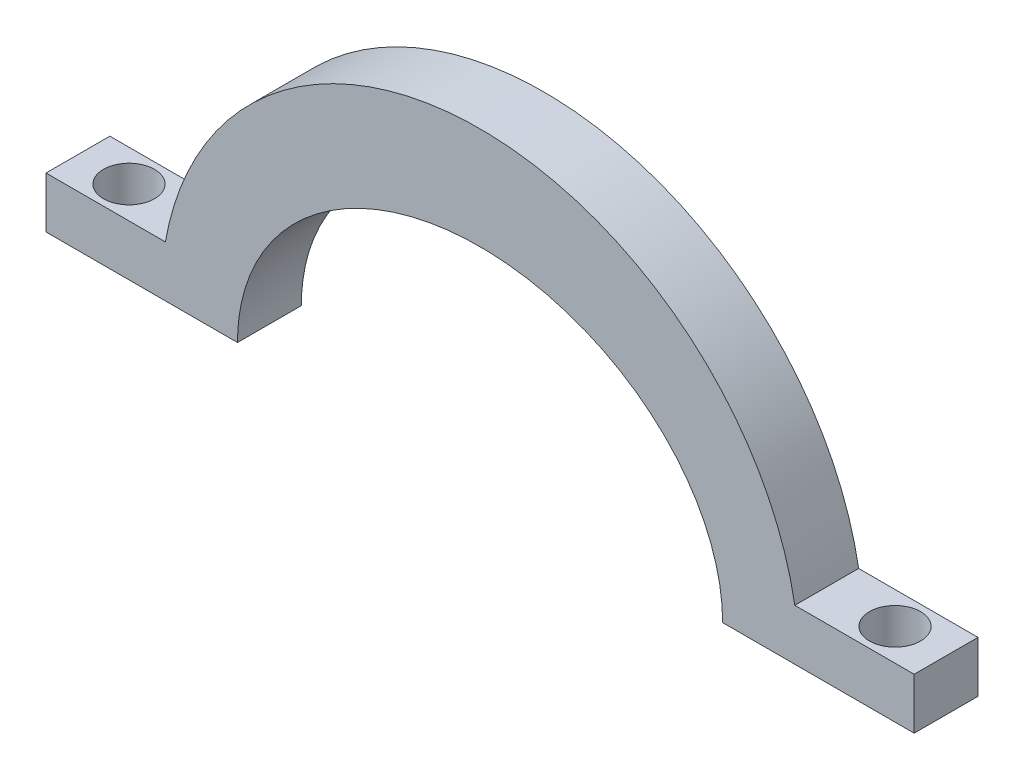
ISO-10303-21;
HEADER;
FILE_DESCRIPTION(('STEP AP214'),'2;1');
FILE_NAME('part.step','',(''),(''),'','','');
FILE_SCHEMA(('AUTOMOTIVE_DESIGN { 1 0 10303 214 1 1 1 1 }'));
ENDSEC;
DATA;
#1=APPLICATION_CONTEXT('core data for automotive mechanical design processes');
#2=APPLICATION_PROTOCOL_DEFINITION('international standard','automotive_design',2000,#1);
#3=PRODUCT_CONTEXT('',#1,'mechanical');
#4=PRODUCT('Part','Part','',(#3));
#5=PRODUCT_RELATED_PRODUCT_CATEGORY('part','',(#4));
#6=PRODUCT_DEFINITION_FORMATION('','',#4);
#7=PRODUCT_DEFINITION_CONTEXT('part definition',#1,'design');
#8=PRODUCT_DEFINITION('design','',#6,#7);
#9=PRODUCT_DEFINITION_SHAPE('','',#8);
#10=(LENGTH_UNIT() NAMED_UNIT(*) SI_UNIT(.MILLI.,.METRE.));
#11=(NAMED_UNIT(*) PLANE_ANGLE_UNIT() SI_UNIT($,.RADIAN.));
#12=(NAMED_UNIT(*) SI_UNIT($,.STERADIAN.) SOLID_ANGLE_UNIT());
#13=UNCERTAINTY_MEASURE_WITH_UNIT(LENGTH_MEASURE(1.E-05),#10,'distance_accuracy_value','');
#14=(GEOMETRIC_REPRESENTATION_CONTEXT(3) GLOBAL_UNCERTAINTY_ASSIGNED_CONTEXT((#13)) GLOBAL_UNIT_ASSIGNED_CONTEXT((#10,
#11,#12)) REPRESENTATION_CONTEXT('',''));
#15=CARTESIAN_POINT('',(0.,0.,0.));
#16=DIRECTION('',(0.,0.,1.));
#17=DIRECTION('',(1.,0.,0.));
#18=AXIS2_PLACEMENT_3D('',#15,#16,#17);
#19=CARTESIAN_POINT('',(0.,0.,5.));
#20=DIRECTION('',(0.,1.,0.));
#21=DIRECTION('',(0.,0.,1.));
#22=AXIS2_PLACEMENT_3D('',#19,#20,#21);
#23=PLANE('',#22);
#24=CARTESIAN_POINT('',(30.,0.,2.5));
#25=DIRECTION('',(0.,-1.,0.));
#26=DIRECTION('',(0.,0.,1.));
#27=AXIS2_PLACEMENT_3D('',#24,#25,#26);
#28=CIRCLE('',#27,2.00000000000001);
#29=CARTESIAN_POINT('',(30.,0.,4.5));
#30=VERTEX_POINT('',#29);
#31=EDGE_CURVE('E214',#30,#30,#28,.T.);
#32=ORIENTED_EDGE('',*,*,#31,.F.);
#33=EDGE_LOOP('',(#32));
#34=FACE_BOUND('',#33,.T.);
#35=DIRECTION('',(1.,0.,0.));
#36=VECTOR('',#35,1.);
#37=CARTESIAN_POINT('',(0.,0.,0.));
#38=LINE('',#37,#36);
#39=CARTESIAN_POINT('',(19.,0.,0.));
#40=VERTEX_POINT('',#39);
#41=CARTESIAN_POINT('',(34.,0.,0.));
#42=VERTEX_POINT('',#41);
#43=EDGE_CURVE('E176',#40,#42,#38,.T.);
#44=ORIENTED_EDGE('',*,*,#43,.T.);
#45=DIRECTION('',(0.,0.,1.));
#46=VECTOR('',#45,1.);
#47=CARTESIAN_POINT('',(34.,0.,5.));
#48=LINE('',#47,#46);
#49=CARTESIAN_POINT('',(34.,0.,5.));
#50=VERTEX_POINT('',#49);
#51=EDGE_CURVE('E147',#42,#50,#48,.T.);
#52=ORIENTED_EDGE('',*,*,#51,.T.);
#53=DIRECTION('',(1.,0.,0.));
#54=VECTOR('',#53,1.);
#55=CARTESIAN_POINT('',(0.,0.,5.));
#56=LINE('',#55,#54);
#57=CARTESIAN_POINT('',(19.,0.,5.));
#58=VERTEX_POINT('',#57);
#59=EDGE_CURVE('E177',#58,#50,#56,.T.);
#60=ORIENTED_EDGE('',*,*,#59,.F.);
#61=DIRECTION('',(0.,0.,-1.));
#62=VECTOR('',#61,1.);
#63=CARTESIAN_POINT('',(19.,0.,5.));
#64=LINE('',#63,#62);
#65=EDGE_CURVE('E58',#58,#40,#64,.T.);
#66=ORIENTED_EDGE('',*,*,#65,.T.);
#67=EDGE_LOOP('',(#44,#52,#60,#66));
#68=FACE_BOUND('',#67,.T.);
#69=ADVANCED_FACE('F47',(#34,#68),#23,.F.);
#70=CARTESIAN_POINT('',(0.,0.,5.));
#71=DIRECTION('',(0.,0.,1.));
#72=DIRECTION('',(1.,0.,0.));
#73=AXIS2_PLACEMENT_3D('',#70,#71,#72);
#74=ELLIPSE('',#73,25.,24.);
#75=DIRECTION('',(0.,0.,-1.));
#76=VECTOR('',#75,1.);
#77=SURFACE_OF_LINEAR_EXTRUSION('',#74,#76);
#78=CARTESIAN_POINT('',(0.,0.,0.));
#79=DIRECTION('',(0.,0.,1.));
#80=DIRECTION('',(1.,0.,0.));
#81=AXIS2_PLACEMENT_3D('',#78,#79,#80);
#82=ELLIPSE('',#81,25.,24.);
#83=CARTESIAN_POINT('',(24.6503324295817,4.,0.));
#84=VERTEX_POINT('',#83);
#85=CARTESIAN_POINT('',(-24.6503324295817,4.,0.));
#86=VERTEX_POINT('',#85);
#87=EDGE_CURVE('E222',#84,#86,#82,.T.);
#88=ORIENTED_EDGE('',*,*,#87,.T.);
#89=DIRECTION('',(0.,0.,-1.));
#90=VECTOR('',#89,1.);
#91=CARTESIAN_POINT('',(-24.6503324295817,4.,5.));
#92=LINE('',#91,#90);
#93=CARTESIAN_POINT('',(-24.6503324295817,4.,5.));
#94=VERTEX_POINT('',#93);
#95=EDGE_CURVE('E173',#86,#94,#92,.F.);
#96=ORIENTED_EDGE('',*,*,#95,.T.);
#97=CARTESIAN_POINT('',(24.6503324295817,4.,5.));
#98=VERTEX_POINT('',#97);
#99=EDGE_CURVE('E66',#98,#94,#74,.T.);
#100=ORIENTED_EDGE('',*,*,#99,.F.);
#101=DIRECTION('',(0.,0.,-1.));
#102=VECTOR('',#101,1.);
#103=CARTESIAN_POINT('',(24.6503324295817,4.,5.));
#104=LINE('',#103,#102);
#105=EDGE_CURVE('E70',#98,#84,#104,.T.);
#106=ORIENTED_EDGE('',*,*,#105,.T.);
#107=EDGE_LOOP('',(#88,#96,#100,#106));
#108=FACE_BOUND('',#107,.T.);
#109=ADVANCED_FACE('F49',(#108),#77,.F.);
#110=CARTESIAN_POINT('',(-30.,0.,2.5));
#111=DIRECTION('',(0.,-1.,0.));
#112=DIRECTION('',(0.,0.,-1.));
#113=AXIS2_PLACEMENT_3D('',#110,#111,#112);
#114=CIRCLE('',#113,2.);
#115=CARTESIAN_POINT('',(-30.,0.,0.499999999999994));
#116=VERTEX_POINT('',#115);
#117=EDGE_CURVE('E299',#116,#116,#114,.T.);
#118=ORIENTED_EDGE('',*,*,#117,.F.);
#119=EDGE_LOOP('',(#118));
#120=FACE_BOUND('',#119,.T.);
#121=CARTESIAN_POINT('',(-34.,0.,0.));
#122=VERTEX_POINT('',#121);
#123=CARTESIAN_POINT('',(-19.,0.,0.));
#124=VERTEX_POINT('',#123);
#125=EDGE_CURVE('E223',#122,#124,#38,.T.);
#126=ORIENTED_EDGE('',*,*,#125,.T.);
#127=DIRECTION('',(0.,0.,-1.));
#128=VECTOR('',#127,1.);
#129=CARTESIAN_POINT('',(-19.,0.,5.));
#130=LINE('',#129,#128);
#131=CARTESIAN_POINT('',(-19.,0.,5.));
#132=VERTEX_POINT('',#131);
#133=EDGE_CURVE('E11',#132,#124,#130,.T.);
#134=ORIENTED_EDGE('',*,*,#133,.F.);
#135=CARTESIAN_POINT('',(-34.,0.,5.));
#136=VERTEX_POINT('',#135);
#137=EDGE_CURVE('E180',#136,#132,#56,.T.);
#138=ORIENTED_EDGE('',*,*,#137,.F.);
#139=DIRECTION('',(0.,0.,-1.));
#140=VECTOR('',#139,1.);
#141=CARTESIAN_POINT('',(-34.,0.,5.));
#142=LINE('',#141,#140);
#143=EDGE_CURVE('E125',#136,#122,#142,.T.);
#144=ORIENTED_EDGE('',*,*,#143,.T.);
#145=EDGE_LOOP('',(#126,#134,#138,#144));
#146=FACE_BOUND('',#145,.T.);
#147=ADVANCED_FACE('F194',(#120,#146),#23,.F.);
#148=CARTESIAN_POINT('',(0.,0.,5.));
#149=DIRECTION('',(0.,0.,1.));
#150=DIRECTION('',(1.,0.,0.));
#151=AXIS2_PLACEMENT_3D('',#148,#149,#150);
#152=ELLIPSE('',#151,19.,16.);
#153=DIRECTION('',(0.,0.,-1.));
#154=VECTOR('',#153,1.);
#155=SURFACE_OF_LINEAR_EXTRUSION('',#152,#154);
#156=CARTESIAN_POINT('',(0.,0.,0.));
#157=DIRECTION('',(0.,0.,1.));
#158=DIRECTION('',(1.,0.,0.));
#159=AXIS2_PLACEMENT_3D('',#156,#157,#158);
#160=ELLIPSE('',#159,19.,16.);
#161=EDGE_CURVE('E179',#40,#124,#160,.T.);
#162=ORIENTED_EDGE('',*,*,#161,.F.);
#163=ORIENTED_EDGE('',*,*,#65,.F.);
#164=EDGE_CURVE('E184',#58,#132,#152,.T.);
#165=ORIENTED_EDGE('',*,*,#164,.T.);
#166=ORIENTED_EDGE('',*,*,#133,.T.);
#167=EDGE_LOOP('',(#162,#163,#165,#166));
#168=FACE_BOUND('',#167,.T.);
#169=ADVANCED_FACE('F191',(#168),#155,.T.);
#170=CARTESIAN_POINT('',(0.,0.,5.));
#171=DIRECTION('',(0.,0.,1.));
#172=DIRECTION('',(1.,0.,0.));
#173=AXIS2_PLACEMENT_3D('',#170,#171,#172);
#174=PLANE('',#173);
#175=ORIENTED_EDGE('',*,*,#164,.F.);
#176=ORIENTED_EDGE('',*,*,#59,.T.);
#177=DIRECTION('',(0.,-1.,0.));
#178=VECTOR('',#177,1.);
#179=CARTESIAN_POINT('',(34.,4.,5.));
#180=LINE('',#179,#178);
#181=CARTESIAN_POINT('',(34.,4.,5.));
#182=VERTEX_POINT('',#181);
#183=EDGE_CURVE('E155',#182,#50,#180,.T.);
#184=ORIENTED_EDGE('',*,*,#183,.F.);
#185=DIRECTION('',(-1.,0.,0.));
#186=VECTOR('',#185,1.);
#187=CARTESIAN_POINT('',(19.,4.,5.));
#188=LINE('',#187,#186);
#189=EDGE_CURVE('E162',#182,#98,#188,.T.);
#190=ORIENTED_EDGE('',*,*,#189,.T.);
#191=ORIENTED_EDGE('',*,*,#99,.T.);
#192=DIRECTION('',(-1.,0.,0.));
#193=VECTOR('',#192,1.);
#194=CARTESIAN_POINT('',(-19.,4.,5.));
#195=LINE('',#194,#193);
#196=CARTESIAN_POINT('',(-34.,4.,5.));
#197=VERTEX_POINT('',#196);
#198=EDGE_CURVE('E114',#94,#197,#195,.T.);
#199=ORIENTED_EDGE('',*,*,#198,.T.);
#200=DIRECTION('',(0.,-1.,0.));
#201=VECTOR('',#200,1.);
#202=CARTESIAN_POINT('',(-34.,4.,5.));
#203=LINE('',#202,#201);
#204=EDGE_CURVE('E118',#197,#136,#203,.T.);
#205=ORIENTED_EDGE('',*,*,#204,.T.);
#206=ORIENTED_EDGE('',*,*,#137,.T.);
#207=EDGE_LOOP('',(#175,#176,#184,#190,#191,#199,#205,#206));
#208=FACE_BOUND('',#207,.T.);
#209=ADVANCED_FACE('F117',(#208),#174,.T.);
#210=CARTESIAN_POINT('',(0.,0.,0.));
#211=DIRECTION('',(0.,0.,1.));
#212=DIRECTION('',(1.,0.,0.));
#213=AXIS2_PLACEMENT_3D('',#210,#211,#212);
#214=PLANE('',#213);
#215=ORIENTED_EDGE('',*,*,#43,.F.);
#216=ORIENTED_EDGE('',*,*,#161,.T.);
#217=ORIENTED_EDGE('',*,*,#125,.F.);
#218=DIRECTION('',(0.,-1.,0.));
#219=VECTOR('',#218,1.);
#220=CARTESIAN_POINT('',(-34.,4.,0.));
#221=LINE('',#220,#219);
#222=CARTESIAN_POINT('',(-34.,4.,0.));
#223=VERTEX_POINT('',#222);
#224=EDGE_CURVE('E134',#223,#122,#221,.T.);
#225=ORIENTED_EDGE('',*,*,#224,.F.);
#226=DIRECTION('',(1.,0.,0.));
#227=VECTOR('',#226,1.);
#228=CARTESIAN_POINT('',(-19.,4.,0.));
#229=LINE('',#228,#227);
#230=EDGE_CURVE('E135',#223,#86,#229,.T.);
#231=ORIENTED_EDGE('',*,*,#230,.T.);
#232=ORIENTED_EDGE('',*,*,#87,.F.);
#233=DIRECTION('',(1.,0.,0.));
#234=VECTOR('',#233,1.);
#235=CARTESIAN_POINT('',(19.,4.,0.));
#236=LINE('',#235,#234);
#237=CARTESIAN_POINT('',(34.,4.,0.));
#238=VERTEX_POINT('',#237);
#239=EDGE_CURVE('E166',#84,#238,#236,.T.);
#240=ORIENTED_EDGE('',*,*,#239,.T.);
#241=DIRECTION('',(0.,-1.,0.));
#242=VECTOR('',#241,1.);
#243=CARTESIAN_POINT('',(34.,4.,0.));
#244=LINE('',#243,#242);
#245=EDGE_CURVE('E150',#238,#42,#244,.T.);
#246=ORIENTED_EDGE('',*,*,#245,.T.);
#247=EDGE_LOOP('',(#215,#216,#217,#225,#231,#232,#240,#246));
#248=FACE_BOUND('',#247,.T.);
#249=ADVANCED_FACE('F196',(#248),#214,.F.);
#250=CARTESIAN_POINT('',(0.,4.,0.));
#251=DIRECTION('',(0.,1.,0.));
#252=DIRECTION('',(0.,0.,1.));
#253=AXIS2_PLACEMENT_3D('',#250,#251,#252);
#254=PLANE('',#253);
#255=CARTESIAN_POINT('',(30.,4.,2.5));
#256=DIRECTION('',(0.,1.,0.));
#257=DIRECTION('',(0.,0.,1.));
#258=AXIS2_PLACEMENT_3D('',#255,#256,#257);
#259=CIRCLE('',#258,2.00000000000001);
#260=CARTESIAN_POINT('',(30.,4.,4.5));
#261=VERTEX_POINT('',#260);
#262=EDGE_CURVE('E52',#261,#261,#259,.T.);
#263=ORIENTED_EDGE('',*,*,#262,.F.);
#264=EDGE_LOOP('',(#263));
#265=FACE_BOUND('',#264,.T.);
#266=ORIENTED_EDGE('',*,*,#105,.F.);
#267=ORIENTED_EDGE('',*,*,#189,.F.);
#268=DIRECTION('',(0.,0.,1.));
#269=VECTOR('',#268,1.);
#270=CARTESIAN_POINT('',(34.,4.,5.));
#271=LINE('',#270,#269);
#272=EDGE_CURVE('E154',#238,#182,#271,.T.);
#273=ORIENTED_EDGE('',*,*,#272,.F.);
#274=ORIENTED_EDGE('',*,*,#239,.F.);
#275=EDGE_LOOP('',(#266,#267,#273,#274));
#276=FACE_BOUND('',#275,.T.);
#277=ADVANCED_FACE('F231',(#265,#276),#254,.T.);
#278=CARTESIAN_POINT('',(34.,4.,5.));
#279=DIRECTION('',(1.,0.,0.));
#280=DIRECTION('',(0.,0.,-1.));
#281=AXIS2_PLACEMENT_3D('',#278,#279,#280);
#282=PLANE('',#281);
#283=ORIENTED_EDGE('',*,*,#51,.F.);
#284=ORIENTED_EDGE('',*,*,#245,.F.);
#285=ORIENTED_EDGE('',*,*,#272,.T.);
#286=ORIENTED_EDGE('',*,*,#183,.T.);
#287=EDGE_LOOP('',(#283,#284,#285,#286));
#288=FACE_BOUND('',#287,.T.);
#289=ADVANCED_FACE('F228',(#288),#282,.T.);
#290=CARTESIAN_POINT('',(0.,4.,0.));
#291=DIRECTION('',(0.,1.,0.));
#292=DIRECTION('',(0.,0.,1.));
#293=AXIS2_PLACEMENT_3D('',#290,#291,#292);
#294=PLANE('',#293);
#295=CARTESIAN_POINT('',(-30.,4.,2.5));
#296=DIRECTION('',(0.,1.,0.));
#297=DIRECTION('',(0.,0.,1.));
#298=AXIS2_PLACEMENT_3D('',#295,#296,#297);
#299=CIRCLE('',#298,2.);
#300=CARTESIAN_POINT('',(-30.,4.,4.5));
#301=VERTEX_POINT('',#300);
#302=EDGE_CURVE('E297',#301,#301,#299,.T.);
#303=ORIENTED_EDGE('',*,*,#302,.F.);
#304=EDGE_LOOP('',(#303));
#305=FACE_BOUND('',#304,.T.);
#306=ORIENTED_EDGE('',*,*,#95,.F.);
#307=ORIENTED_EDGE('',*,*,#230,.F.);
#308=DIRECTION('',(0.,0.,-1.));
#309=VECTOR('',#308,1.);
#310=CARTESIAN_POINT('',(-34.,4.,5.));
#311=LINE('',#310,#309);
#312=EDGE_CURVE('E124',#197,#223,#311,.T.);
#313=ORIENTED_EDGE('',*,*,#312,.F.);
#314=ORIENTED_EDGE('',*,*,#198,.F.);
#315=EDGE_LOOP('',(#306,#307,#313,#314));
#316=FACE_BOUND('',#315,.T.);
#317=ADVANCED_FACE('F137',(#305,#316),#294,.T.);
#318=CARTESIAN_POINT('',(-34.,4.,5.));
#319=DIRECTION('',(-1.,0.,0.));
#320=DIRECTION('',(0.,0.,1.));
#321=AXIS2_PLACEMENT_3D('',#318,#319,#320);
#322=PLANE('',#321);
#323=ORIENTED_EDGE('',*,*,#143,.F.);
#324=ORIENTED_EDGE('',*,*,#204,.F.);
#325=ORIENTED_EDGE('',*,*,#312,.T.);
#326=ORIENTED_EDGE('',*,*,#224,.T.);
#327=EDGE_LOOP('',(#323,#324,#325,#326));
#328=FACE_BOUND('',#327,.T.);
#329=ADVANCED_FACE('F129',(#328),#322,.T.);
#330=CARTESIAN_POINT('',(-30.,24.,2.5));
#331=DIRECTION('',(0.,-1.,0.));
#332=DIRECTION('',(0.,0.,-1.));
#333=AXIS2_PLACEMENT_3D('',#330,#331,#332);
#334=CYLINDRICAL_SURFACE('',#333,2.);
#335=ORIENTED_EDGE('',*,*,#302,.T.);
#336=EDGE_LOOP('',(#335));
#337=FACE_BOUND('',#336,.T.);
#338=ORIENTED_EDGE('',*,*,#117,.T.);
#339=EDGE_LOOP('',(#338));
#340=FACE_BOUND('',#339,.T.);
#341=ADVANCED_FACE('F263',(#337,#340),#334,.F.);
#342=CARTESIAN_POINT('',(30.,24.,2.5));
#343=DIRECTION('',(0.,-1.,0.));
#344=DIRECTION('',(0.,0.,-1.));
#345=AXIS2_PLACEMENT_3D('',#342,#343,#344);
#346=CYLINDRICAL_SURFACE('',#345,2.00000000000001);
#347=ORIENTED_EDGE('',*,*,#262,.T.);
#348=EDGE_LOOP('',(#347));
#349=FACE_BOUND('',#348,.T.);
#350=ORIENTED_EDGE('',*,*,#31,.T.);
#351=EDGE_LOOP('',(#350));
#352=FACE_BOUND('',#351,.T.);
#353=ADVANCED_FACE('F277',(#349,#352),#346,.F.);
#354=CLOSED_SHELL('',(#69,#109,#147,#169,#209,#249,#277,#289,#317,#329,#341,#353));
#355=MANIFOLD_SOLID_BREP('B2',#354);
#356=ADVANCED_BREP_SHAPE_REPRESENTATION('',(#18,#355),#14);
#357=SHAPE_DEFINITION_REPRESENTATION(#9,#356);
ENDSEC;
END-ISO-10303-21;
